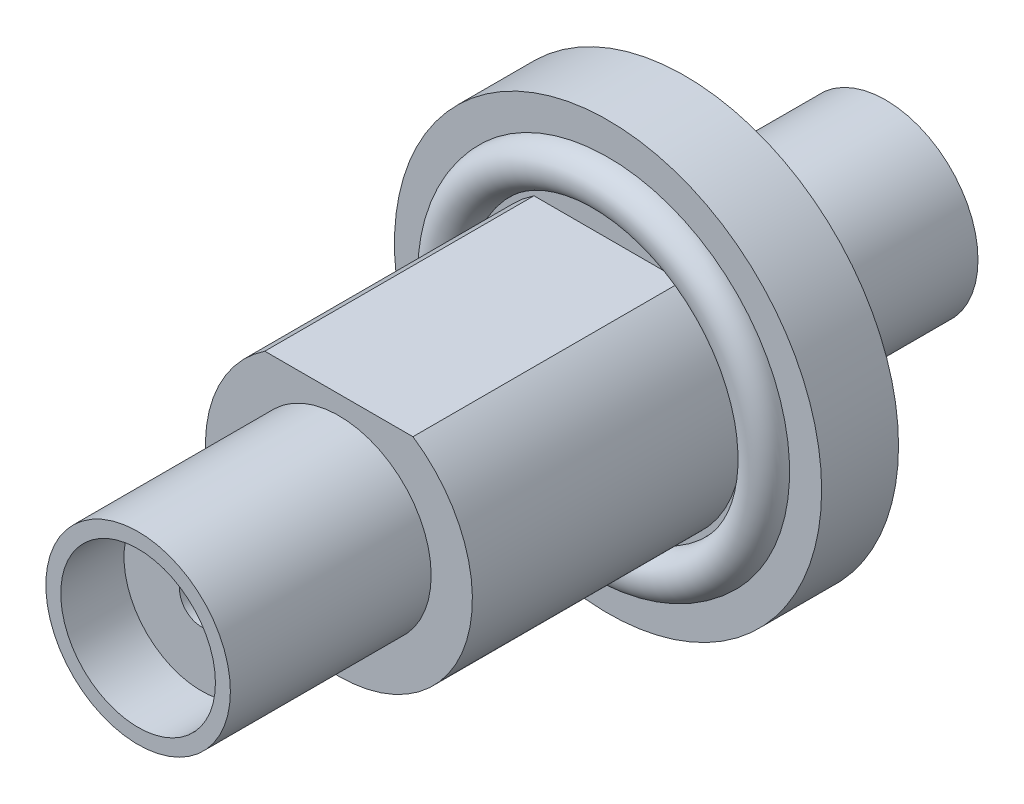
ISO-10303-21;
HEADER;
FILE_DESCRIPTION(('STEP AP214'),'2;1');
FILE_NAME('part.step','',(''),(''),'','','');
FILE_SCHEMA(('AUTOMOTIVE_DESIGN { 1 0 10303 214 1 1 1 1 }'));
ENDSEC;
DATA;
#1=APPLICATION_CONTEXT('core data for automotive mechanical design processes');
#2=APPLICATION_PROTOCOL_DEFINITION('international standard','automotive_design',2000,#1);
#3=PRODUCT_CONTEXT('',#1,'mechanical');
#4=PRODUCT('Part','Part','',(#3));
#5=PRODUCT_RELATED_PRODUCT_CATEGORY('part','',(#4));
#6=PRODUCT_DEFINITION_FORMATION('','',#4);
#7=PRODUCT_DEFINITION_CONTEXT('part definition',#1,'design');
#8=PRODUCT_DEFINITION('design','',#6,#7);
#9=PRODUCT_DEFINITION_SHAPE('','',#8);
#10=(LENGTH_UNIT() NAMED_UNIT(*) SI_UNIT(.MILLI.,.METRE.));
#11=(NAMED_UNIT(*) PLANE_ANGLE_UNIT() SI_UNIT($,.RADIAN.));
#12=(NAMED_UNIT(*) SI_UNIT($,.STERADIAN.) SOLID_ANGLE_UNIT());
#13=UNCERTAINTY_MEASURE_WITH_UNIT(LENGTH_MEASURE(1.E-05),#10,'distance_accuracy_value','');
#14=(GEOMETRIC_REPRESENTATION_CONTEXT(3) GLOBAL_UNCERTAINTY_ASSIGNED_CONTEXT((#13)) GLOBAL_UNIT_ASSIGNED_CONTEXT((#10,
#11,#12)) REPRESENTATION_CONTEXT('',''));
#15=CARTESIAN_POINT('',(0.,0.,0.));
#16=DIRECTION('',(0.,0.,1.));
#17=DIRECTION('',(1.,0.,0.));
#18=AXIS2_PLACEMENT_3D('',#15,#16,#17);
#19=CARTESIAN_POINT('',(0.,0.,2.286));
#20=DIRECTION('',(0.,0.,-1.));
#21=DIRECTION('',(-1.,0.,0.));
#22=AXIS2_PLACEMENT_3D('',#19,#20,#21);
#23=TOROIDAL_SURFACE('',#22,4.7625,0.635);
#24=CARTESIAN_POINT('',(-5.3975,0.,2.286));
#25=VERTEX_POINT('',#24);
#26=VERTEX_LOOP('',#25);
#27=FACE_BOUND('',#26,.T.);
#28=ADVANCED_FACE('F46',(#27),#23,.T.);
#29=CLOSED_SHELL('',(#28));
#30=MANIFOLD_SOLID_BREP('B2',#29);
#31=CARTESIAN_POINT('',(0.,0.,10.287));
#32=DIRECTION('',(0.,0.,1.));
#33=DIRECTION('',(1.,0.,0.));
#34=AXIS2_PLACEMENT_3D('',#31,#32,#33);
#35=PLANE('',#34);
#36=CARTESIAN_POINT('',(0.,0.,10.287));
#37=DIRECTION('',(0.,0.,1.));
#38=DIRECTION('',(1.,0.,0.));
#39=AXIS2_PLACEMENT_3D('',#36,#37,#38);
#40=CIRCLE('',#39,2.7432);
#41=CARTESIAN_POINT('',(2.7432,0.,10.287));
#42=VERTEX_POINT('',#41);
#43=EDGE_CURVE('E101',#42,#42,#40,.T.);
#44=ORIENTED_EDGE('',*,*,#43,.F.);
#45=EDGE_LOOP('',(#44));
#46=FACE_BOUND('',#45,.T.);
#47=CARTESIAN_POINT('',(0.,0.,10.287));
#48=DIRECTION('',(0.,0.,1.));
#49=DIRECTION('',(1.,0.,0.));
#50=AXIS2_PLACEMENT_3D('',#47,#48,#49);
#51=CIRCLE('',#50,3.96875);
#52=CARTESIAN_POINT('',(-2.2017657828434,3.302,10.287));
#53=VERTEX_POINT('',#52);
#54=CARTESIAN_POINT('',(2.2017657828434,3.302,10.287));
#55=VERTEX_POINT('',#54);
#56=EDGE_CURVE('E95',#53,#55,#51,.T.);
#57=ORIENTED_EDGE('',*,*,#56,.T.);
#58=DIRECTION('',(1.,0.,0.));
#59=VECTOR('',#58,1.);
#60=CARTESIAN_POINT('',(-3.96875,3.302,10.287));
#61=LINE('',#60,#59);
#62=EDGE_CURVE('E77',#53,#55,#61,.T.);
#63=ORIENTED_EDGE('',*,*,#62,.F.);
#64=EDGE_LOOP('',(#57,#63));
#65=FACE_BOUND('',#64,.T.);
#66=ADVANCED_FACE('F58',(#46,#65),#35,.T.);
#67=CARTESIAN_POINT('',(0.,0.,10.287));
#68=DIRECTION('',(0.,0.,-1.));
#69=DIRECTION('',(-1.,0.,0.));
#70=AXIS2_PLACEMENT_3D('',#67,#68,#69);
#71=CYLINDRICAL_SURFACE('',#70,3.96875);
#72=DIRECTION('',(0.,0.,-1.));
#73=VECTOR('',#72,1.);
#74=CARTESIAN_POINT('',(2.2017657828434,3.302,10.287));
#75=LINE('',#74,#73);
#76=CARTESIAN_POINT('',(2.2017657828434,3.302,2.286));
#77=VERTEX_POINT('',#76);
#78=EDGE_CURVE('E44',#55,#77,#75,.T.);
#79=ORIENTED_EDGE('',*,*,#78,.F.);
#80=ORIENTED_EDGE('',*,*,#56,.F.);
#81=DIRECTION('',(0.,0.,-1.));
#82=VECTOR('',#81,1.);
#83=CARTESIAN_POINT('',(-2.2017657828434,3.302,10.287));
#84=LINE('',#83,#82);
#85=CARTESIAN_POINT('',(-2.2017657828434,3.302,2.286));
#86=VERTEX_POINT('',#85);
#87=EDGE_CURVE('E66',#86,#53,#84,.F.);
#88=ORIENTED_EDGE('',*,*,#87,.F.);
#89=CARTESIAN_POINT('',(0.,0.,2.286));
#90=DIRECTION('',(0.,0.,1.));
#91=DIRECTION('',(1.,0.,0.));
#92=AXIS2_PLACEMENT_3D('',#89,#90,#91);
#93=CIRCLE('',#92,3.96875);
#94=EDGE_CURVE('E91',#86,#77,#93,.T.);
#95=ORIENTED_EDGE('',*,*,#94,.T.);
#96=EDGE_LOOP('',(#79,#80,#88,#95));
#97=FACE_BOUND('',#96,.T.);
#98=ADVANCED_FACE('F94',(#97),#71,.T.);
#99=CARTESIAN_POINT('',(0.,0.,2.286));
#100=DIRECTION('',(0.,0.,1.));
#101=DIRECTION('',(1.,0.,0.));
#102=AXIS2_PLACEMENT_3D('',#99,#100,#101);
#103=PLANE('',#102);
#104=DIRECTION('',(-1.,0.,0.));
#105=VECTOR('',#104,1.);
#106=CARTESIAN_POINT('',(-3.96875,3.302,2.286));
#107=LINE('',#106,#105);
#108=EDGE_CURVE('E72',#77,#86,#107,.T.);
#109=ORIENTED_EDGE('',*,*,#108,.F.);
#110=ORIENTED_EDGE('',*,*,#94,.F.);
#111=EDGE_LOOP('',(#109,#110));
#112=FACE_BOUND('',#111,.T.);
#113=CARTESIAN_POINT('',(0.,0.,2.286));
#114=DIRECTION('',(0.,0.,-1.));
#115=DIRECTION('',(-1.,0.,0.));
#116=AXIS2_PLACEMENT_3D('',#113,#114,#115);
#117=CIRCLE('',#116,4.1275);
#118=CARTESIAN_POINT('',(-4.1275,0.,2.286));
#119=VERTEX_POINT('',#118);
#120=EDGE_CURVE('E138',#119,#119,#117,.T.);
#121=ORIENTED_EDGE('',*,*,#120,.F.);
#122=EDGE_LOOP('',(#121));
#123=FACE_BOUND('',#122,.T.);
#124=ADVANCED_FACE('F89',(#112,#123),#103,.T.);
#125=CARTESIAN_POINT('',(0.,0.,16.256));
#126=DIRECTION('',(0.,0.,-1.));
#127=DIRECTION('',(-1.,0.,0.));
#128=AXIS2_PLACEMENT_3D('',#125,#126,#127);
#129=CYLINDRICAL_SURFACE('',#128,2.7432);
#130=CARTESIAN_POINT('',(0.,0.,16.256));
#131=DIRECTION('',(0.,0.,1.));
#132=DIRECTION('',(1.,0.,0.));
#133=AXIS2_PLACEMENT_3D('',#130,#131,#132);
#134=CIRCLE('',#133,2.7432);
#135=CARTESIAN_POINT('',(2.7432,0.,16.256));
#136=VERTEX_POINT('',#135);
#137=EDGE_CURVE('E96',#136,#136,#134,.T.);
#138=ORIENTED_EDGE('',*,*,#137,.F.);
#139=EDGE_LOOP('',(#138));
#140=FACE_BOUND('',#139,.T.);
#141=ORIENTED_EDGE('',*,*,#43,.T.);
#142=EDGE_LOOP('',(#141));
#143=FACE_BOUND('',#142,.T.);
#144=ADVANCED_FACE('F155',(#140,#143),#129,.T.);
#145=CARTESIAN_POINT('',(0.,0.,16.256));
#146=DIRECTION('',(0.,0.,1.));
#147=DIRECTION('',(1.,0.,0.));
#148=AXIS2_PLACEMENT_3D('',#145,#146,#147);
#149=PLANE('',#148);
#150=CARTESIAN_POINT('',(0.,0.,16.256));
#151=DIRECTION('',(0.,0.,1.));
#152=DIRECTION('',(1.,0.,0.));
#153=AXIS2_PLACEMENT_3D('',#150,#151,#152);
#154=CIRCLE('',#153,2.2987);
#155=CARTESIAN_POINT('',(2.2987,0.,16.256));
#156=VERTEX_POINT('',#155);
#157=EDGE_CURVE('E147',#156,#156,#154,.T.);
#158=ORIENTED_EDGE('',*,*,#157,.F.);
#159=EDGE_LOOP('',(#158));
#160=FACE_BOUND('',#159,.T.);
#161=ORIENTED_EDGE('',*,*,#137,.T.);
#162=EDGE_LOOP('',(#161));
#163=FACE_BOUND('',#162,.T.);
#164=ADVANCED_FACE('F309',(#160,#163),#149,.T.);
#165=CARTESIAN_POINT('',(0.,0.,14.3764));
#166=DIRECTION('',(0.,0.,1.));
#167=DIRECTION('',(1.,0.,0.));
#168=AXIS2_PLACEMENT_3D('',#165,#166,#167);
#169=CYLINDRICAL_SURFACE('',#168,2.2987);
#170=CARTESIAN_POINT('',(0.,0.,14.3764));
#171=DIRECTION('',(0.,0.,1.));
#172=DIRECTION('',(1.,0.,0.));
#173=AXIS2_PLACEMENT_3D('',#170,#171,#172);
#174=CIRCLE('',#173,2.2987);
#175=CARTESIAN_POINT('',(2.2987,0.,14.3764));
#176=VERTEX_POINT('',#175);
#177=EDGE_CURVE('E148',#176,#176,#174,.T.);
#178=ORIENTED_EDGE('',*,*,#177,.F.);
#179=EDGE_LOOP('',(#178));
#180=FACE_BOUND('',#179,.T.);
#181=ORIENTED_EDGE('',*,*,#157,.T.);
#182=EDGE_LOOP('',(#181));
#183=FACE_BOUND('',#182,.T.);
#184=ADVANCED_FACE('F319',(#180,#183),#169,.F.);
#185=CARTESIAN_POINT('',(0.,0.,14.3764));
#186=DIRECTION('',(0.,0.,1.));
#187=DIRECTION('',(1.,0.,0.));
#188=AXIS2_PLACEMENT_3D('',#185,#186,#187);
#189=PLANE('',#188);
#190=CARTESIAN_POINT('',(0.,0.,14.3764));
#191=DIRECTION('',(0.,0.,1.));
#192=DIRECTION('',(1.,0.,0.));
#193=AXIS2_PLACEMENT_3D('',#190,#191,#192);
#194=CIRCLE('',#193,0.6477);
#195=CARTESIAN_POINT('',(0.6477,0.,14.3764));
#196=VERTEX_POINT('',#195);
#197=EDGE_CURVE('E141',#196,#196,#194,.T.);
#198=ORIENTED_EDGE('',*,*,#197,.F.);
#199=EDGE_LOOP('',(#198));
#200=FACE_BOUND('',#199,.T.);
#201=ORIENTED_EDGE('',*,*,#177,.T.);
#202=EDGE_LOOP('',(#201));
#203=FACE_BOUND('',#202,.T.);
#204=ADVANCED_FACE('F327',(#200,#203),#189,.T.);
#205=CARTESIAN_POINT('',(0.,0.,0.454027751301891));
#206=DIRECTION('',(0.,0.,1.));
#207=DIRECTION('',(1.,0.,0.));
#208=AXIS2_PLACEMENT_3D('',#205,#206,#207);
#209=CYLINDRICAL_SURFACE('',#208,0.6477);
#210=CARTESIAN_POINT('',(0.,0.,2.286));
#211=DIRECTION('',(0.,0.,1.));
#212=DIRECTION('',(1.,0.,0.));
#213=AXIS2_PLACEMENT_3D('',#210,#211,#212);
#214=CIRCLE('',#213,0.6477);
#215=CARTESIAN_POINT('',(0.6477,0.,2.286));
#216=VERTEX_POINT('',#215);
#217=EDGE_CURVE('E144',#216,#216,#214,.F.);
#218=ORIENTED_EDGE('',*,*,#217,.T.);
#219=EDGE_LOOP('',(#218));
#220=FACE_BOUND('',#219,.T.);
#221=ORIENTED_EDGE('',*,*,#197,.T.);
#222=EDGE_LOOP('',(#221));
#223=FACE_BOUND('',#222,.T.);
#224=ADVANCED_FACE('F333',(#220,#223),#209,.F.);
#225=CARTESIAN_POINT('',(0.,0.,2.286));
#226=DIRECTION('',(0.,0.,1.));
#227=DIRECTION('',(1.,0.,0.));
#228=AXIS2_PLACEMENT_3D('',#225,#226,#227);
#229=PLANE('',#228);
#230=ORIENTED_EDGE('',*,*,#217,.F.);
#231=EDGE_LOOP('',(#230));
#232=FACE_BOUND('',#231,.T.);
#233=ADVANCED_FACE('F268',(#232),#229,.T.);
#234=CARTESIAN_POINT('',(0.,0.,-7.08025));
#235=DIRECTION('',(0.,0.,-1.));
#236=DIRECTION('',(-1.,0.,0.));
#237=AXIS2_PLACEMENT_3D('',#234,#235,#236);
#238=CYLINDRICAL_SURFACE('',#237,4.1275);
#239=CARTESIAN_POINT('',(0.,0.,1.651));
#240=DIRECTION('',(0.,0.,-1.));
#241=DIRECTION('',(-1.,0.,0.));
#242=AXIS2_PLACEMENT_3D('',#239,#240,#241);
#243=CIRCLE('',#242,4.1275);
#244=CARTESIAN_POINT('',(-4.1275,0.,1.651));
#245=VERTEX_POINT('',#244);
#246=EDGE_CURVE('E135',#245,#245,#243,.T.);
#247=ORIENTED_EDGE('',*,*,#246,.F.);
#248=EDGE_LOOP('',(#247));
#249=FACE_BOUND('',#248,.T.);
#250=ORIENTED_EDGE('',*,*,#120,.T.);
#251=EDGE_LOOP('',(#250));
#252=FACE_BOUND('',#251,.T.);
#253=ADVANCED_FACE('F260',(#249,#252),#238,.T.);
#254=CARTESIAN_POINT('',(0.,5.3975,1.651));
#255=DIRECTION('',(0.,0.,-1.));
#256=DIRECTION('',(-1.,0.,0.));
#257=AXIS2_PLACEMENT_3D('',#254,#255,#256);
#258=PLANE('',#257);
#259=CARTESIAN_POINT('',(0.,0.,1.651));
#260=DIRECTION('',(0.,0.,-1.));
#261=DIRECTION('',(-1.,0.,0.));
#262=AXIS2_PLACEMENT_3D('',#259,#260,#261);
#263=CIRCLE('',#262,5.3975);
#264=CARTESIAN_POINT('',(-5.3975,0.,1.651));
#265=VERTEX_POINT('',#264);
#266=EDGE_CURVE('E132',#265,#265,#263,.T.);
#267=ORIENTED_EDGE('',*,*,#266,.F.);
#268=EDGE_LOOP('',(#267));
#269=FACE_BOUND('',#268,.T.);
#270=ORIENTED_EDGE('',*,*,#246,.T.);
#271=EDGE_LOOP('',(#270));
#272=FACE_BOUND('',#271,.T.);
#273=ADVANCED_FACE('F253',(#269,#272),#258,.F.);
#274=CARTESIAN_POINT('',(0.,0.,-7.08025));
#275=DIRECTION('',(0.,0.,-1.));
#276=DIRECTION('',(-1.,0.,0.));
#277=AXIS2_PLACEMENT_3D('',#274,#275,#276);
#278=CYLINDRICAL_SURFACE('',#277,5.3975);
#279=CARTESIAN_POINT('',(0.,0.,2.286));
#280=DIRECTION('',(0.,0.,-1.));
#281=DIRECTION('',(-1.,0.,0.));
#282=AXIS2_PLACEMENT_3D('',#279,#280,#281);
#283=CIRCLE('',#282,5.3975);
#284=CARTESIAN_POINT('',(-5.3975,0.,2.286));
#285=VERTEX_POINT('',#284);
#286=EDGE_CURVE('E92',#285,#285,#283,.T.);
#287=ORIENTED_EDGE('',*,*,#286,.F.);
#288=EDGE_LOOP('',(#287));
#289=FACE_BOUND('',#288,.T.);
#290=ORIENTED_EDGE('',*,*,#266,.T.);
#291=EDGE_LOOP('',(#290));
#292=FACE_BOUND('',#291,.T.);
#293=ADVANCED_FACE('F174',(#289,#292),#278,.F.);
#294=CARTESIAN_POINT('',(0.,0.,0.));
#295=DIRECTION('',(0.,0.,1.));
#296=DIRECTION('',(1.,0.,0.));
#297=AXIS2_PLACEMENT_3D('',#294,#295,#296);
#298=PLANE('',#297);
#299=CARTESIAN_POINT('',(0.,0.,0.));
#300=DIRECTION('',(0.,0.,1.));
#301=DIRECTION('',(1.,0.,0.));
#302=AXIS2_PLACEMENT_3D('',#299,#300,#301);
#303=CIRCLE('',#302,0.6477);
#304=CARTESIAN_POINT('',(0.6477,0.,0.));
#305=VERTEX_POINT('',#304);
#306=EDGE_CURVE('E107',#305,#305,#303,.F.);
#307=ORIENTED_EDGE('',*,*,#306,.T.);
#308=EDGE_LOOP('',(#307));
#309=FACE_BOUND('',#308,.T.);
#310=ADVANCED_FACE('F170',(#309),#298,.F.);
#311=CARTESIAN_POINT('',(0.,0.,1.83197224869811));
#312=DIRECTION('',(0.,0.,-1.));
#313=DIRECTION('',(-1.,0.,0.));
#314=AXIS2_PLACEMENT_3D('',#311,#312,#313);
#315=CYLINDRICAL_SURFACE('',#314,0.6477);
#316=CARTESIAN_POINT('',(0.,0.,-4.0894));
#317=DIRECTION('',(0.,0.,-1.));
#318=DIRECTION('',(-1.,0.,0.));
#319=AXIS2_PLACEMENT_3D('',#316,#317,#318);
#320=CIRCLE('',#319,0.6477);
#321=CARTESIAN_POINT('',(-0.6477,0.,-4.0894));
#322=VERTEX_POINT('',#321);
#323=EDGE_CURVE('E98',#322,#322,#320,.T.);
#324=ORIENTED_EDGE('',*,*,#323,.T.);
#325=EDGE_LOOP('',(#324));
#326=FACE_BOUND('',#325,.T.);
#327=ORIENTED_EDGE('',*,*,#306,.F.);
#328=EDGE_LOOP('',(#327));
#329=FACE_BOUND('',#328,.T.);
#330=ADVANCED_FACE('F166',(#326,#329),#315,.F.);
#331=CARTESIAN_POINT('',(0.,0.,-4.0894));
#332=DIRECTION('',(0.,0.,-1.));
#333=DIRECTION('',(-1.,0.,0.));
#334=AXIS2_PLACEMENT_3D('',#331,#332,#333);
#335=PLANE('',#334);
#336=ORIENTED_EDGE('',*,*,#323,.F.);
#337=EDGE_LOOP('',(#336));
#338=FACE_BOUND('',#337,.T.);
#339=CARTESIAN_POINT('',(0.,0.,-4.0894));
#340=DIRECTION('',(0.,0.,-1.));
#341=DIRECTION('',(-1.,0.,0.));
#342=AXIS2_PLACEMENT_3D('',#339,#340,#341);
#343=CIRCLE('',#342,2.2987);
#344=CARTESIAN_POINT('',(-2.2987,0.,-4.0894));
#345=VERTEX_POINT('',#344);
#346=EDGE_CURVE('E111',#345,#345,#343,.T.);
#347=ORIENTED_EDGE('',*,*,#346,.T.);
#348=EDGE_LOOP('',(#347));
#349=FACE_BOUND('',#348,.T.);
#350=ADVANCED_FACE('F169',(#338,#349),#335,.T.);
#351=CARTESIAN_POINT('',(0.,0.,-4.0894));
#352=DIRECTION('',(0.,0.,-1.));
#353=DIRECTION('',(-1.,0.,0.));
#354=AXIS2_PLACEMENT_3D('',#351,#352,#353);
#355=CYLINDRICAL_SURFACE('',#354,2.2987);
#356=ORIENTED_EDGE('',*,*,#346,.F.);
#357=EDGE_LOOP('',(#356));
#358=FACE_BOUND('',#357,.T.);
#359=CARTESIAN_POINT('',(0.,0.,-5.969));
#360=DIRECTION('',(0.,0.,-1.));
#361=DIRECTION('',(-1.,0.,0.));
#362=AXIS2_PLACEMENT_3D('',#359,#360,#361);
#363=CIRCLE('',#362,2.2987);
#364=CARTESIAN_POINT('',(-2.2987,0.,-5.969));
#365=VERTEX_POINT('',#364);
#366=EDGE_CURVE('E110',#365,#365,#363,.T.);
#367=ORIENTED_EDGE('',*,*,#366,.T.);
#368=EDGE_LOOP('',(#367));
#369=FACE_BOUND('',#368,.T.);
#370=ADVANCED_FACE('F178',(#358,#369),#355,.F.);
#371=CARTESIAN_POINT('',(0.,0.,-5.969));
#372=DIRECTION('',(0.,0.,-1.));
#373=DIRECTION('',(-1.,0.,0.));
#374=AXIS2_PLACEMENT_3D('',#371,#372,#373);
#375=PLANE('',#374);
#376=ORIENTED_EDGE('',*,*,#366,.F.);
#377=EDGE_LOOP('',(#376));
#378=FACE_BOUND('',#377,.T.);
#379=CARTESIAN_POINT('',(0.,0.,-5.969));
#380=DIRECTION('',(0.,0.,-1.));
#381=DIRECTION('',(-1.,0.,0.));
#382=AXIS2_PLACEMENT_3D('',#379,#380,#381);
#383=CIRCLE('',#382,2.7432);
#384=CARTESIAN_POINT('',(-2.7432,0.,-5.969));
#385=VERTEX_POINT('',#384);
#386=EDGE_CURVE('E114',#385,#385,#383,.T.);
#387=ORIENTED_EDGE('',*,*,#386,.T.);
#388=EDGE_LOOP('',(#387));
#389=FACE_BOUND('',#388,.T.);
#390=ADVANCED_FACE('F182',(#378,#389),#375,.T.);
#391=CARTESIAN_POINT('',(0.,0.,-5.969));
#392=DIRECTION('',(0.,0.,1.));
#393=DIRECTION('',(1.,0.,0.));
#394=AXIS2_PLACEMENT_3D('',#391,#392,#393);
#395=CYLINDRICAL_SURFACE('',#394,2.7432);
#396=ORIENTED_EDGE('',*,*,#386,.F.);
#397=EDGE_LOOP('',(#396));
#398=FACE_BOUND('',#397,.T.);
#399=CARTESIAN_POINT('',(0.,0.,0.));
#400=DIRECTION('',(0.,0.,1.));
#401=DIRECTION('',(1.,0.,0.));
#402=AXIS2_PLACEMENT_3D('',#399,#400,#401);
#403=CIRCLE('',#402,2.7432);
#404=CARTESIAN_POINT('',(2.7432,0.,0.));
#405=VERTEX_POINT('',#404);
#406=EDGE_CURVE('E123',#405,#405,#403,.F.);
#407=ORIENTED_EDGE('',*,*,#406,.T.);
#408=EDGE_LOOP('',(#407));
#409=FACE_BOUND('',#408,.T.);
#410=ADVANCED_FACE('F186',(#398,#409),#395,.T.);
#411=CARTESIAN_POINT('',(0.,0.,0.));
#412=DIRECTION('',(0.,0.,1.));
#413=DIRECTION('',(1.,0.,0.));
#414=AXIS2_PLACEMENT_3D('',#411,#412,#413);
#415=PLANE('',#414);
#416=CARTESIAN_POINT('',(0.,0.,0.));
#417=DIRECTION('',(0.,0.,1.));
#418=DIRECTION('',(1.,0.,0.));
#419=AXIS2_PLACEMENT_3D('',#416,#417,#418);
#420=CIRCLE('',#419,6.35);
#421=CARTESIAN_POINT('',(6.35,0.,0.));
#422=VERTEX_POINT('',#421);
#423=EDGE_CURVE('E119',#422,#422,#420,.T.);
#424=ORIENTED_EDGE('',*,*,#423,.F.);
#425=EDGE_LOOP('',(#424));
#426=FACE_BOUND('',#425,.T.);
#427=ORIENTED_EDGE('',*,*,#406,.F.);
#428=EDGE_LOOP('',(#427));
#429=FACE_BOUND('',#428,.T.);
#430=ADVANCED_FACE('F190',(#426,#429),#415,.F.);
#431=CARTESIAN_POINT('',(0.,0.,2.286));
#432=DIRECTION('',(0.,0.,-1.));
#433=DIRECTION('',(-1.,0.,0.));
#434=AXIS2_PLACEMENT_3D('',#431,#432,#433);
#435=CYLINDRICAL_SURFACE('',#434,6.35);
#436=CARTESIAN_POINT('',(0.,0.,2.286));
#437=DIRECTION('',(0.,0.,1.));
#438=DIRECTION('',(1.,0.,0.));
#439=AXIS2_PLACEMENT_3D('',#436,#437,#438);
#440=CIRCLE('',#439,6.35);
#441=CARTESIAN_POINT('',(6.35,0.,2.286));
#442=VERTEX_POINT('',#441);
#443=EDGE_CURVE('E120',#442,#442,#440,.T.);
#444=ORIENTED_EDGE('',*,*,#443,.F.);
#445=EDGE_LOOP('',(#444));
#446=FACE_BOUND('',#445,.T.);
#447=ORIENTED_EDGE('',*,*,#423,.T.);
#448=EDGE_LOOP('',(#447));
#449=FACE_BOUND('',#448,.T.);
#450=ADVANCED_FACE('F60',(#446,#449),#435,.T.);
#451=ORIENTED_EDGE('',*,*,#286,.T.);
#452=EDGE_LOOP('',(#451));
#453=FACE_BOUND('',#452,.T.);
#454=ORIENTED_EDGE('',*,*,#443,.T.);
#455=EDGE_LOOP('',(#454));
#456=FACE_BOUND('',#455,.T.);
#457=ADVANCED_FACE('F192',(#453,#456),#103,.T.);
#458=CARTESIAN_POINT('',(-3.96875,3.302,10.287));
#459=DIRECTION('',(0.,1.,0.));
#460=DIRECTION('',(0.,0.,1.));
#461=AXIS2_PLACEMENT_3D('',#458,#459,#460);
#462=PLANE('',#461);
#463=ORIENTED_EDGE('',*,*,#78,.T.);
#464=ORIENTED_EDGE('',*,*,#108,.T.);
#465=ORIENTED_EDGE('',*,*,#87,.T.);
#466=ORIENTED_EDGE('',*,*,#62,.T.);
#467=EDGE_LOOP('',(#463,#464,#465,#466));
#468=FACE_BOUND('',#467,.T.);
#469=ADVANCED_FACE('F82',(#468),#462,.T.);
#470=CLOSED_SHELL('',(#66,#98,#124,#144,#164,#184,#204,#224,#233,#253,#273,#293,#310,#330,#350,
#370,#390,#410,#430,#450,#457,#469));
#471=MANIFOLD_SOLID_BREP('B6',#470);
#472=ADVANCED_BREP_SHAPE_REPRESENTATION('',(#18,#30,#471),#14);
#473=SHAPE_DEFINITION_REPRESENTATION(#9,#472);
ENDSEC;
END-ISO-10303-21;
